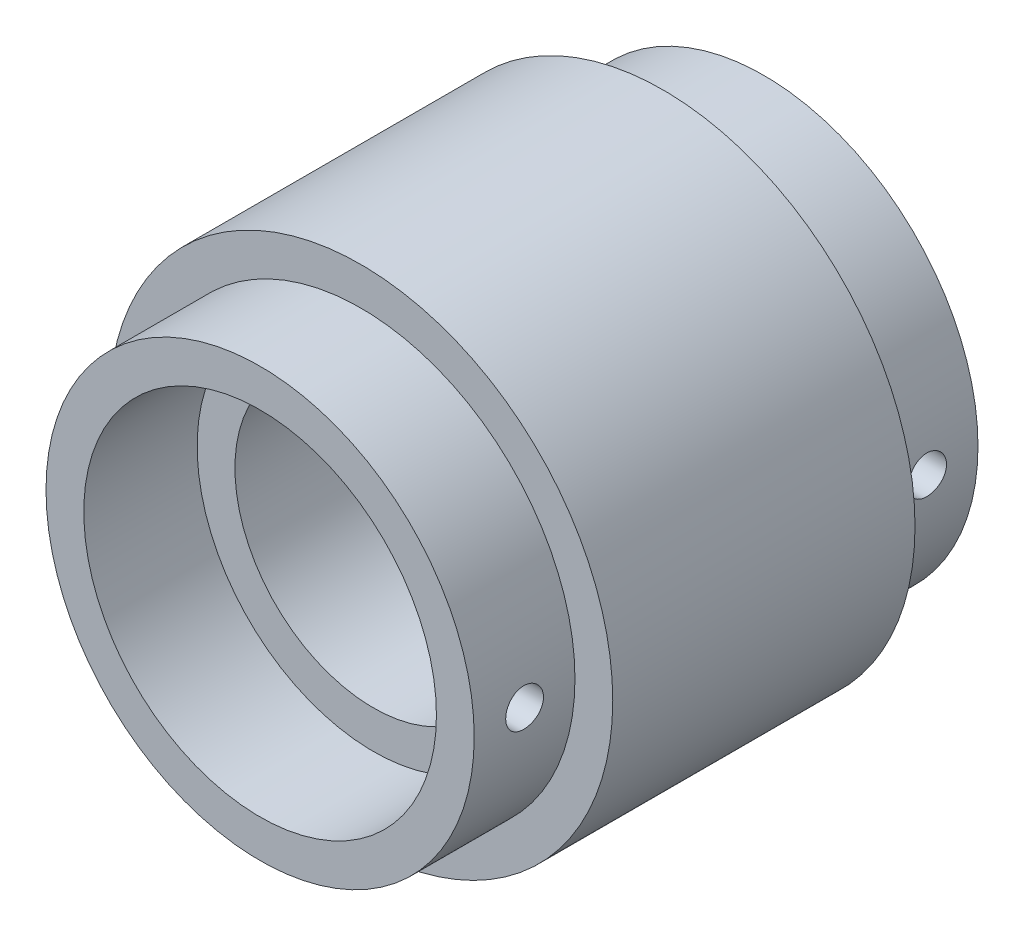
ISO-10303-21;
HEADER;
FILE_DESCRIPTION(('STEP AP214'),'2;1');
FILE_NAME('part.step','',(''),(''),'','','');
FILE_SCHEMA(('AUTOMOTIVE_DESIGN { 1 0 10303 214 1 1 1 1 }'));
ENDSEC;
DATA;
#1=APPLICATION_CONTEXT('core data for automotive mechanical design processes');
#2=APPLICATION_PROTOCOL_DEFINITION('international standard','automotive_design',2000,#1);
#3=PRODUCT_CONTEXT('',#1,'mechanical');
#4=PRODUCT('Part','Part','',(#3));
#5=PRODUCT_RELATED_PRODUCT_CATEGORY('part','',(#4));
#6=PRODUCT_DEFINITION_FORMATION('','',#4);
#7=PRODUCT_DEFINITION_CONTEXT('part definition',#1,'design');
#8=PRODUCT_DEFINITION('design','',#6,#7);
#9=PRODUCT_DEFINITION_SHAPE('','',#8);
#10=(LENGTH_UNIT() NAMED_UNIT(*) SI_UNIT(.MILLI.,.METRE.));
#11=(NAMED_UNIT(*) PLANE_ANGLE_UNIT() SI_UNIT($,.RADIAN.));
#12=(NAMED_UNIT(*) SI_UNIT($,.STERADIAN.) SOLID_ANGLE_UNIT());
#13=UNCERTAINTY_MEASURE_WITH_UNIT(LENGTH_MEASURE(1.E-05),#10,'distance_accuracy_value','');
#14=(GEOMETRIC_REPRESENTATION_CONTEXT(3) GLOBAL_UNCERTAINTY_ASSIGNED_CONTEXT((#13)) GLOBAL_UNIT_ASSIGNED_CONTEXT((#10,
#11,#12)) REPRESENTATION_CONTEXT('',''));
#15=CARTESIAN_POINT('',(0.,0.,0.));
#16=DIRECTION('',(0.,0.,1.));
#17=DIRECTION('',(1.,0.,0.));
#18=AXIS2_PLACEMENT_3D('',#15,#16,#17);
#19=CARTESIAN_POINT('',(0.,0.,20.));
#20=DIRECTION('',(0.,0.,1.));
#21=DIRECTION('',(1.,0.,0.));
#22=AXIS2_PLACEMENT_3D('',#19,#20,#21);
#23=CYLINDRICAL_SURFACE('',#22,14.);
#24=CARTESIAN_POINT('',(0.,0.,11.));
#25=DIRECTION('',(0.,0.,1.));
#26=DIRECTION('',(1.,0.,0.));
#27=AXIS2_PLACEMENT_3D('',#24,#25,#26);
#28=CIRCLE('',#27,14.);
#29=CARTESIAN_POINT('',(14.,0.,11.));
#30=VERTEX_POINT('',#29);
#31=EDGE_CURVE('E38',#30,#30,#28,.T.);
#32=ORIENTED_EDGE('',*,*,#31,.F.);
#33=EDGE_LOOP('',(#32));
#34=FACE_BOUND('',#33,.T.);
#35=CARTESIAN_POINT('',(0.,0.,20.));
#36=DIRECTION('',(0.,0.,1.));
#37=DIRECTION('',(1.,0.,0.));
#38=AXIS2_PLACEMENT_3D('',#35,#36,#37);
#39=CIRCLE('',#38,14.);
#40=CARTESIAN_POINT('',(14.,0.,20.));
#41=VERTEX_POINT('',#40);
#42=EDGE_CURVE('E42',#41,#41,#39,.T.);
#43=ORIENTED_EDGE('',*,*,#42,.T.);
#44=EDGE_LOOP('',(#43));
#45=FACE_BOUND('',#44,.T.);
#46=CARTESIAN_POINT('',(14.,0.,14.5));
#47=CARTESIAN_POINT('',(13.9999989720618,-0.0839973684623564,14.5000036207019));
#48=CARTESIAN_POINT('',(13.9992360275065,-0.168049471788861,14.5070793221215));
#49=CARTESIAN_POINT('',(13.9962658597227,-0.333821153364659,14.5351975840512));
#50=CARTESIAN_POINT('',(13.9940570672004,-0.415538096384694,14.5562553207345));
#51=CARTESIAN_POINT('',(13.9884444049242,-0.574215086679191,14.6117156111501));
#52=CARTESIAN_POINT('',(13.9850412789497,-0.651178059521745,14.6461098608724));
#53=CARTESIAN_POINT('',(13.9774199420794,-0.798222664781042,14.7272501675866));
#54=CARTESIAN_POINT('',(13.9732018874118,-0.868305612275356,14.7739938577237));
#55=CARTESIAN_POINT('',(13.964403436078,-0.999904467230662,14.8787117019334));
#56=CARTESIAN_POINT('',(13.959821772381,-1.06138815276102,14.9367262467107));
#57=CARTESIAN_POINT('',(13.9508228918212,-1.17376607832023,15.0622526231375));
#58=CARTESIAN_POINT('',(13.9464056827682,-1.22465981597738,15.1297649050912));
#59=CARTESIAN_POINT('',(13.9382230587834,-1.31452903007566,15.2725742909415));
#60=CARTESIAN_POINT('',(13.9344592647275,-1.35347504707262,15.3478900343593));
#61=CARTESIAN_POINT('',(13.9280256549691,-1.41815517868436,15.5040394574843));
#62=CARTESIAN_POINT('',(13.9253558084694,-1.44388966523887,15.5848729817787));
#63=CARTESIAN_POINT('',(13.9214240491911,-1.48131999143385,15.7494329661843));
#64=CARTESIAN_POINT('',(13.9201567479638,-1.49306957301225,15.8331470713884));
#65=CARTESIAN_POINT('',(13.919156916522,-1.50236273378441,16.0013678978012));
#66=CARTESIAN_POINT('',(13.9194243403621,-1.49990673825451,16.0858745952063));
#67=CARTESIAN_POINT('',(13.9214588185844,-1.48090270755366,16.2529102447853));
#68=CARTESIAN_POINT('',(13.9232196140191,-1.46441348676883,16.3354459753885));
#69=CARTESIAN_POINT('',(13.92803266796,-1.41790265413675,16.4965718512746));
#70=CARTESIAN_POINT('',(13.9310849462276,-1.38788083522162,16.575161936163));
#71=CARTESIAN_POINT('',(13.9381442300285,-1.31509254595635,16.7263506188431));
#72=CARTESIAN_POINT('',(13.9421531763498,-1.27230012313471,16.7989366277697));
#73=CARTESIAN_POINT('',(13.9506724910759,-1.17520397125327,16.9359189016586));
#74=CARTESIAN_POINT('',(13.9551828763347,-1.12089985521526,17.0003148911879));
#75=CARTESIAN_POINT('',(13.964224741634,-1.00199398737117,17.1194308272547));
#76=CARTESIAN_POINT('',(13.9687562128002,-0.937341467650281,17.1741001088758));
#77=CARTESIAN_POINT('',(13.9773081517919,-0.79974993270207,17.2718176057708));
#78=CARTESIAN_POINT('',(13.9813286189078,-0.726810905968591,17.3148658049081));
#79=CARTESIAN_POINT('',(13.9884071619177,-0.574680679930816,17.388117667482));
#80=CARTESIAN_POINT('',(13.9914650333095,-0.495488156543226,17.4183186020122));
#81=CARTESIAN_POINT('',(13.996271832416,-0.333116173755533,17.4649806998032));
#82=CARTESIAN_POINT('',(13.9980208050858,-0.249936851389131,17.4814423349517));
#83=CARTESIAN_POINT('',(14.0000069536861,-0.082391003259108,17.5000939080794));
#84=CARTESIAN_POINT('',(14.0002515320482,0.0019676589614681,17.5023537278468));
#85=CARTESIAN_POINT('',(13.999221220073,0.169862499172727,17.4927212957146));
#86=CARTESIAN_POINT('',(13.9979463533593,0.253398689930399,17.4808292638405));
#87=CARTESIAN_POINT('',(13.9940250997174,0.417074417596074,17.4432886972512));
#88=CARTESIAN_POINT('',(13.9913819912927,0.497221580734071,17.4176730412053));
#89=CARTESIAN_POINT('',(13.9850206034345,0.652081625351161,17.3534462526011));
#90=CARTESIAN_POINT('',(13.9813022965487,0.726794368015868,17.3148347882255));
#91=CARTESIAN_POINT('',(13.9731875979172,0.868979698172293,17.2255402299778));
#92=CARTESIAN_POINT('',(13.9687886603917,0.936423420726922,17.174811409086));
#93=CARTESIAN_POINT('',(13.9598140395794,1.0618636536134,17.062787475555));
#94=CARTESIAN_POINT('',(13.955238351189,1.11985989089444,17.001492057626));
#95=CARTESIAN_POINT('',(13.9464035114229,1.22500289525196,16.869769183513));
#96=CARTESIAN_POINT('',(13.9421457513136,1.27210367548466,16.799304913417));
#97=CARTESIAN_POINT('',(13.9344504956076,1.35380220515131,16.6514253530529));
#98=CARTESIAN_POINT('',(13.9310129873748,1.38840014719752,16.5740101698898));
#99=CARTESIAN_POINT('',(13.9253563662176,1.44403456823946,16.4145815618943));
#100=CARTESIAN_POINT('',(13.9231348303938,1.4650980301971,16.3325776426312));
#101=CARTESIAN_POINT('',(13.9201543262932,1.49315296500731,16.1661718429898));
#102=CARTESIAN_POINT('',(13.9193953092803,1.50014490677259,16.0817700426125));
#103=CARTESIAN_POINT('',(13.9194269169975,1.49985126967978,15.913421505837));
#104=CARTESIAN_POINT('',(13.9202097012228,1.49263792882135,15.8294746326706));
#105=CARTESIAN_POINT('',(13.9232199578512,1.46429034750351,15.6639928721513));
#106=CARTESIAN_POINT('',(13.9254474315429,1.44315609462868,15.5824579869496));
#107=CARTESIAN_POINT('',(13.9310938471125,1.38758726934598,15.4241176286987));
#108=CARTESIAN_POINT('',(13.9345125661186,1.35315518471866,15.3473112741424));
#109=CARTESIAN_POINT('',(13.9421567007954,1.27197540134453,15.2005560163175));
#110=CARTESIAN_POINT('',(13.9463821158424,1.22522771211909,15.1306071077473));
#111=CARTESIAN_POINT('',(13.9551893042071,1.12047309614238,14.9991822389677));
#112=CARTESIAN_POINT('',(13.9597727171597,1.06241229533165,14.9377493283454));
#113=CARTESIAN_POINT('',(13.9687645955809,0.936788436693425,14.8254680641987));
#114=CARTESIAN_POINT('',(13.9731730190714,0.869223116281761,14.7746222381358));
#115=CARTESIAN_POINT('',(13.9813315236118,0.726294289727543,14.6848415429898));
#116=CARTESIAN_POINT('',(13.985079694864,0.650909132345846,14.6459409923291));
#117=CARTESIAN_POINT('',(13.9914751074927,0.4946830501634,14.5814034976389));
#118=CARTESIAN_POINT('',(13.9941235777272,0.413848333053745,14.5557517409156));
#119=CARTESIAN_POINT('',(13.997362764335,0.277138279310809,14.5247693925093));
#120=CARTESIAN_POINT('',(13.9983470622526,0.222133982989378,14.5154937322981));
#121=CARTESIAN_POINT('',(13.9996660194708,0.111427819030549,14.5031078501412));
#122=CARTESIAN_POINT('',(14.0000006819599,0.0557259548181626,14.4999975979358));
#123=CARTESIAN_POINT('',(14.,0.,14.5));
#124=B_SPLINE_CURVE_WITH_KNOTS('',3,(#46,#47,#48,#49,#50,#51,#52,#53,#54,#55,#56,#57,#58,#59,
#60,#61,#62,#63,#64,#65,#66,#67,#68,#69,#70,#71,#72,#73,#74,#75,#76,#77,#78,#79,#80,#81,#82,#83,
#84,#85,#86,#87,#88,#89,#90,#91,#92,#93,#94,#95,#96,#97,#98,#99,#100,#101,#102,#103,#104,#105,
#106,#107,#108,#109,#110,#111,#112,#113,#114,#115,#116,#117,#118,#119,#120,#121,#122,#123),
.UNSPECIFIED.,.T.,.F.,(4,2,2,2,2,2,2,2,2,2,2,2,2,2,2,2,2,2,2,2,2,2,2,2,2,2,2,2,2,2,2,2,2,2,2,2,
2,2,4),(0.,0.251788599945356,0.503850940260849,0.755756584763052,1.00761398480183,
1.26039117907526,1.5131803619984,1.76658792718727,2.01998835788766,2.27241183115226,
2.52482774758373,2.77619094881418,3.02755799638761,3.27943939251041,3.531329257246,
3.78449503509989,4.03766116448934,4.29088104245252,4.54409222301009,4.79605646471764,
5.04801678907029,5.29937615584524,5.55074194097749,5.80307171791347,6.05540878638004,
6.30879222304767,6.5621717560548,6.81504455967778,7.067908936547,7.31949074464278,
7.57107277711321,7.82260776597885,8.07414256037933,8.32690582829999,8.57972936954861,
8.83327261241941,9.08653176657272,9.25357544028006,9.42061829413531),.UNSPECIFIED.);
#125=CARTESIAN_POINT('',(14.,0.,14.5));
#126=VERTEX_POINT('',#125);
#127=EDGE_CURVE('E73',#126,#126,#124,.T.);
#128=ORIENTED_EDGE('',*,*,#127,.F.);
#129=EDGE_LOOP('',(#128));
#130=FACE_BOUND('',#129,.T.);
#131=ADVANCED_FACE('F31',(#34,#45,#130),#23,.F.);
#132=CARTESIAN_POINT('',(0.,0.,12.));
#133=DIRECTION('',(0.,0.,1.));
#134=DIRECTION('',(1.,0.,0.));
#135=AXIS2_PLACEMENT_3D('',#132,#133,#134);
#136=CYLINDRICAL_SURFACE('',#135,17.);
#137=CARTESIAN_POINT('',(0.,0.,20.));
#138=DIRECTION('',(0.,0.,1.));
#139=DIRECTION('',(1.,0.,0.));
#140=AXIS2_PLACEMENT_3D('',#137,#138,#139);
#141=CIRCLE('',#140,17.);
#142=CARTESIAN_POINT('',(17.,0.,20.));
#143=VERTEX_POINT('',#142);
#144=EDGE_CURVE('E52',#143,#143,#141,.T.);
#145=ORIENTED_EDGE('',*,*,#144,.F.);
#146=EDGE_LOOP('',(#145));
#147=FACE_BOUND('',#146,.T.);
#148=CARTESIAN_POINT('',(0.,0.,12.));
#149=DIRECTION('',(0.,0.,1.));
#150=DIRECTION('',(1.,0.,0.));
#151=AXIS2_PLACEMENT_3D('',#148,#149,#150);
#152=CIRCLE('',#151,17.);
#153=CARTESIAN_POINT('',(17.,0.,12.));
#154=VERTEX_POINT('',#153);
#155=EDGE_CURVE('E51',#154,#154,#152,.T.);
#156=ORIENTED_EDGE('',*,*,#155,.T.);
#157=EDGE_LOOP('',(#156));
#158=FACE_BOUND('',#157,.T.);
#159=CARTESIAN_POINT('',(17.,0.,17.5));
#160=CARTESIAN_POINT('',(16.9999991366692,0.0840802358664998,17.4999963358136));
#161=CARTESIAN_POINT('',(16.9993695779826,0.168217256556168,17.4929067281508));
#162=CARTESIAN_POINT('',(16.9969186756702,0.334162101229269,17.4647299984391));
#163=CARTESIAN_POINT('',(16.9950959921048,0.41596719842642,17.4436271384143));
#164=CARTESIAN_POINT('',(16.9904647505681,0.574820875222161,17.3880400381334));
#165=CARTESIAN_POINT('',(16.987656760896,0.651872166635592,17.3535635102583));
#166=CARTESIAN_POINT('',(16.9813695548534,0.799076197986142,17.2722218661469));
#167=CARTESIAN_POINT('',(16.9778904793125,0.869230380650742,17.2253593483915));
#168=CARTESIAN_POINT('',(16.9706402702899,1.00086587600031,17.1204326359042));
#169=CARTESIAN_POINT('',(16.9668684232275,1.06232489780315,17.062340523003));
#170=CARTESIAN_POINT('',(16.9594637448475,1.17463411612825,16.9366628211714));
#171=CARTESIAN_POINT('',(16.9558309197295,1.22548383998342,16.8690768094917));
#172=CARTESIAN_POINT('',(16.9491080590586,1.31520757683625,16.726193431763));
#173=CARTESIAN_POINT('',(16.9460189232131,1.35406181812048,16.6508836040906));
#174=CARTESIAN_POINT('',(16.9407415951097,1.4185653804641,16.4947770863768));
#175=CARTESIAN_POINT('',(16.9385533852002,1.44421496024305,16.4139805038728));
#176=CARTESIAN_POINT('',(16.9353318119117,1.48151599727451,16.2494186319148));
#177=CARTESIAN_POINT('',(16.9342954355067,1.4932039820181,16.1656616820616));
#178=CARTESIAN_POINT('',(16.9334854039232,1.50236291350133,15.9973689116293));
#179=CARTESIAN_POINT('',(16.9337117224385,1.49983415642455,15.9128331073131));
#180=CARTESIAN_POINT('',(16.9353987670437,1.48066155151999,15.7456330149522));
#181=CARTESIAN_POINT('',(16.9368560169532,1.46405745233264,15.6629641290013));
#182=CARTESIAN_POINT('',(16.9408352833957,1.41726727227212,15.5015911801985));
#183=CARTESIAN_POINT('',(16.9433573114304,1.38708104468568,15.422887160185));
#184=CARTESIAN_POINT('',(16.949185966917,1.31393915314471,15.2715516941627));
#185=CARTESIAN_POINT('',(16.9524936854572,1.27096571042549,15.1989288845309));
#186=CARTESIAN_POINT('',(16.9595200433788,1.17348205158942,15.0619117959138));
#187=CARTESIAN_POINT('',(16.9632386921032,1.11897157314286,14.9975177040868));
#188=CARTESIAN_POINT('',(16.9706833852774,0.999738513125818,14.8785548838013));
#189=CARTESIAN_POINT('',(16.9744094114053,0.934981578037633,14.8240205798198));
#190=CARTESIAN_POINT('',(16.9814369213681,0.797213511535078,14.7265917065545));
#191=CARTESIAN_POINT('',(16.984738404872,0.72420237368621,14.6836971463444));
#192=CARTESIAN_POINT('',(16.9905455904275,0.571975637683148,14.6107673127884));
#193=CARTESIAN_POINT('',(16.9930511943361,0.492759275839951,14.5807336252059));
#194=CARTESIAN_POINT('',(16.996983221751,0.330381291940774,14.5344024948699));
#195=CARTESIAN_POINT('',(16.9984096703698,0.247219761738224,14.5181047324754));
#196=CARTESIAN_POINT('',(17.0000194423459,0.0796104030231009,14.499751387245));
#197=CARTESIAN_POINT('',(17.0002069148657,-0.00483218206200147,14.4976482679761));
#198=CARTESIAN_POINT('',(16.9993287054252,-0.172868703136017,14.5076192906525));
#199=CARTESIAN_POINT('',(16.9982630365922,-0.256462648005644,14.5196932840849));
#200=CARTESIAN_POINT('',(16.9950010291973,-0.420292963294032,14.5576363855799));
#201=CARTESIAN_POINT('',(16.9928065018153,-0.500534490142742,14.5834833981096));
#202=CARTESIAN_POINT('',(16.9875332102989,-0.655542086495677,14.6482162300089));
#203=CARTESIAN_POINT('',(16.9844544305543,-0.73030805930762,14.687102279566));
#204=CARTESIAN_POINT('',(16.9777472136144,-0.872458160373809,14.7769283803514));
#205=CARTESIAN_POINT('',(16.9741173526791,-0.939822365439241,14.827899852119));
#206=CARTESIAN_POINT('',(16.9667203650642,-1.06505544188414,14.940404609123));
#207=CARTESIAN_POINT('',(16.9629532357112,-1.12292412819998,15.0019381001608));
#208=CARTESIAN_POINT('',(16.9556939504594,-1.22768709603156,15.1340267804784));
#209=CARTESIAN_POINT('',(16.9522025910796,-1.27455030776123,15.2046066618826));
#210=CARTESIAN_POINT('',(16.9459016871797,-1.35575886575025,15.35266202157));
#211=CARTESIAN_POINT('',(16.9430921351492,-1.39010434989805,15.4301374238842));
#212=CARTESIAN_POINT('',(16.9384775839307,-1.44524983562932,15.5896755241072));
#213=CARTESIAN_POINT('',(16.9366711856513,-1.46606870960856,15.6717316565099));
#214=CARTESIAN_POINT('',(16.9342628924147,-1.49363139208435,15.8381915045614));
#215=CARTESIAN_POINT('',(16.9336609712026,-1.5003755073806,15.9225951689984));
#216=CARTESIAN_POINT('',(16.9337302183425,-1.49959349529965,16.0910453959998));
#217=CARTESIAN_POINT('',(16.934397031893,-1.49211618154857,16.1750921912636));
#218=CARTESIAN_POINT('',(16.936919354309,-1.46320550589638,16.340731154193));
#219=CARTESIAN_POINT('',(16.9387748648697,-1.44177212409336,16.4223233183579));
#220=CARTESIAN_POINT('',(16.9434643498395,-1.38557040876227,16.5807390934135));
#221=CARTESIAN_POINT('',(16.9462982480851,-1.35080311320261,16.6575630749392));
#222=CARTESIAN_POINT('',(16.9526253396978,-1.26892580427019,16.8042920474838));
#223=CARTESIAN_POINT('',(16.9561185245598,-1.22181595011684,16.8741971277408));
#224=CARTESIAN_POINT('',(16.9633848931066,-1.11640728077523,17.0053539357469));
#225=CARTESIAN_POINT('',(16.9671589585558,-1.05807223244496,17.0665764947836));
#226=CARTESIAN_POINT('',(16.9745537766173,-0.931936963261482,17.1783875140416));
#227=CARTESIAN_POINT('',(16.97817449202,-0.864134462128933,17.2289734049954));
#228=CARTESIAN_POINT('',(16.9848619761362,-0.72084309897252,17.3181516747292));
#229=CARTESIAN_POINT('',(16.9879276001517,-0.645338844429667,17.3567193852657));
#230=CARTESIAN_POINT('',(16.9931463894423,-0.488949731353307,17.4205795640191));
#231=CARTESIAN_POINT('',(16.9953005975204,-0.408071145215391,17.4458872117812));
#232=CARTESIAN_POINT('',(16.9979040364892,-0.272267186189504,17.4761005258256));
#233=CARTESIAN_POINT('',(16.9986864208092,-0.218213808395126,17.485050825264));
#234=CARTESIAN_POINT('',(16.9997346827935,-0.109448307539669,17.4970017459999));
#235=CARTESIAN_POINT('',(17.0000005620279,-0.0547361864815625,17.5000023853833));
#236=CARTESIAN_POINT('',(17.,0.,17.5));
#237=B_SPLINE_CURVE_WITH_KNOTS('',3,(#159,#160,#161,#162,#163,#164,#165,#166,#167,#168,#169,
#170,#171,#172,#173,#174,#175,#176,#177,#178,#179,#180,#181,#182,#183,#184,#185,#186,#187,#188,
#189,#190,#191,#192,#193,#194,#195,#196,#197,#198,#199,#200,#201,#202,#203,#204,#205,#206,#207,
#208,#209,#210,#211,#212,#213,#214,#215,#216,#217,#218,#219,#220,#221,#222,#223,#224,#225,#226,
#227,#228,#229,#230,#231,#232,#233,#234,#235,#236),.UNSPECIFIED.,.T.,.F.,(4,2,2,2,2,2,2,2,2,2,2,
2,2,2,2,2,2,2,2,2,2,2,2,2,2,2,2,2,2,2,2,2,2,2,2,2,2,2,4),(0.,0.252040852757286,
0.504365246877548,0.756544345352496,1.00867058061989,1.26143188749012,1.51420445301807,
1.76739145693377,2.02057349995601,2.27309168593404,2.52560461111023,2.77740680852379,
3.02921172595373,3.28136839051262,3.53353078923872,3.78655726723963,4.03958394248665,
4.2926418072939,4.54569378316716,4.79789789108671,5.05009935705509,5.30189743849976,
5.55369996535094,5.80616446692186,6.05863388833423,6.31180771599295,6.5649787547431,
6.81779580511232,7.07060734455154,7.32255269951578,7.57449841376498,7.8264245194705,
8.07834737548103,8.33109746875406,8.58390854338802,8.83723516529166,9.09027115274212,
9.25435010556812,9.4184285596224),.UNSPECIFIED.);
#238=CARTESIAN_POINT('',(17.,0.,17.5));
#239=VERTEX_POINT('',#238);
#240=EDGE_CURVE('E104',#239,#239,#237,.T.);
#241=ORIENTED_EDGE('',*,*,#240,.T.);
#242=EDGE_LOOP('',(#241));
#243=FACE_BOUND('',#242,.T.);
#244=ADVANCED_FACE('F128',(#147,#158,#243),#136,.T.);
#245=CARTESIAN_POINT('',(0.,0.,-20.));
#246=DIRECTION('',(0.,0.,-1.));
#247=DIRECTION('',(-1.,0.,0.));
#248=AXIS2_PLACEMENT_3D('',#245,#246,#247);
#249=CYLINDRICAL_SURFACE('',#248,14.);
#250=CARTESIAN_POINT('',(0.,0.,-11.));
#251=DIRECTION('',(0.,0.,-1.));
#252=DIRECTION('',(-1.,0.,0.));
#253=AXIS2_PLACEMENT_3D('',#250,#251,#252);
#254=CIRCLE('',#253,14.);
#255=CARTESIAN_POINT('',(-14.,0.,-11.));
#256=VERTEX_POINT('',#255);
#257=EDGE_CURVE('E60',#256,#256,#254,.T.);
#258=ORIENTED_EDGE('',*,*,#257,.F.);
#259=EDGE_LOOP('',(#258));
#260=FACE_BOUND('',#259,.T.);
#261=CARTESIAN_POINT('',(0.,0.,-20.));
#262=DIRECTION('',(0.,0.,-1.));
#263=DIRECTION('',(-1.,0.,0.));
#264=AXIS2_PLACEMENT_3D('',#261,#262,#263);
#265=CIRCLE('',#264,14.);
#266=CARTESIAN_POINT('',(-14.,0.,-20.));
#267=VERTEX_POINT('',#266);
#268=EDGE_CURVE('E63',#267,#267,#265,.T.);
#269=ORIENTED_EDGE('',*,*,#268,.T.);
#270=EDGE_LOOP('',(#269));
#271=FACE_BOUND('',#270,.T.);
#272=CARTESIAN_POINT('',(14.,0.,-14.5));
#273=CARTESIAN_POINT('',(13.9999989720618,0.0839973684623564,-14.5000036207019));
#274=CARTESIAN_POINT('',(13.9992360275065,0.168049471788861,-14.5070793221215));
#275=CARTESIAN_POINT('',(13.9962658597227,0.333821153364659,-14.5351975840512));
#276=CARTESIAN_POINT('',(13.9940570672004,0.415538096384694,-14.5562553207345));
#277=CARTESIAN_POINT('',(13.9884444049242,0.574215086679191,-14.6117156111501));
#278=CARTESIAN_POINT('',(13.9850412789497,0.651178059521745,-14.6461098608724));
#279=CARTESIAN_POINT('',(13.9774199420794,0.798222664781042,-14.7272501675866));
#280=CARTESIAN_POINT('',(13.9732018874118,0.868305612275356,-14.7739938577237));
#281=CARTESIAN_POINT('',(13.964403436078,0.999904467230662,-14.8787117019334));
#282=CARTESIAN_POINT('',(13.959821772381,1.06138815276102,-14.9367262467107));
#283=CARTESIAN_POINT('',(13.9508228918212,1.17376607832023,-15.0622526231375));
#284=CARTESIAN_POINT('',(13.9464056827682,1.22465981597738,-15.1297649050912));
#285=CARTESIAN_POINT('',(13.9382230587834,1.31452903007566,-15.2725742909415));
#286=CARTESIAN_POINT('',(13.9344592647275,1.35347504707262,-15.3478900343593));
#287=CARTESIAN_POINT('',(13.9280256549691,1.41815517868436,-15.5040394574843));
#288=CARTESIAN_POINT('',(13.9253558084694,1.44388966523887,-15.5848729817787));
#289=CARTESIAN_POINT('',(13.9214240491911,1.48131999143385,-15.7494329661843));
#290=CARTESIAN_POINT('',(13.9201567479638,1.49306957301225,-15.8331470713884));
#291=CARTESIAN_POINT('',(13.919156916522,1.50236273378441,-16.0013678978012));
#292=CARTESIAN_POINT('',(13.9194243403621,1.49990673825451,-16.0858745952063));
#293=CARTESIAN_POINT('',(13.9214588185844,1.48090270755366,-16.2529102447853));
#294=CARTESIAN_POINT('',(13.9232196140191,1.46441348676883,-16.3354459753885));
#295=CARTESIAN_POINT('',(13.92803266796,1.41790265413675,-16.4965718512746));
#296=CARTESIAN_POINT('',(13.9310849462276,1.38788083522162,-16.575161936163));
#297=CARTESIAN_POINT('',(13.9381442300285,1.31509254595635,-16.7263506188431));
#298=CARTESIAN_POINT('',(13.9421531763498,1.27230012313471,-16.7989366277697));
#299=CARTESIAN_POINT('',(13.9506724910759,1.17520397125327,-16.9359189016586));
#300=CARTESIAN_POINT('',(13.9551828763347,1.12089985521526,-17.0003148911879));
#301=CARTESIAN_POINT('',(13.964224741634,1.00199398737117,-17.1194308272547));
#302=CARTESIAN_POINT('',(13.9687562128002,0.937341467650281,-17.1741001088758));
#303=CARTESIAN_POINT('',(13.9773081517919,0.79974993270207,-17.2718176057708));
#304=CARTESIAN_POINT('',(13.9813286189078,0.726810905968591,-17.3148658049081));
#305=CARTESIAN_POINT('',(13.9884071619177,0.574680679930816,-17.388117667482));
#306=CARTESIAN_POINT('',(13.9914650333095,0.495488156543226,-17.4183186020122));
#307=CARTESIAN_POINT('',(13.996271832416,0.333116173755533,-17.4649806998032));
#308=CARTESIAN_POINT('',(13.9980208050858,0.249936851389131,-17.4814423349517));
#309=CARTESIAN_POINT('',(14.0000069536861,0.082391003259108,-17.5000939080794));
#310=CARTESIAN_POINT('',(14.0002515320482,-0.0019676589614681,-17.5023537278468));
#311=CARTESIAN_POINT('',(13.999221220073,-0.169862499172727,-17.4927212957146));
#312=CARTESIAN_POINT('',(13.9979463533593,-0.253398689930399,-17.4808292638405));
#313=CARTESIAN_POINT('',(13.9940250997174,-0.417074417596074,-17.4432886972512));
#314=CARTESIAN_POINT('',(13.9913819912927,-0.497221580734071,-17.4176730412053));
#315=CARTESIAN_POINT('',(13.9850206034345,-0.652081625351161,-17.3534462526011));
#316=CARTESIAN_POINT('',(13.9813022965487,-0.726794368015868,-17.3148347882255));
#317=CARTESIAN_POINT('',(13.9731875979172,-0.868979698172293,-17.2255402299778));
#318=CARTESIAN_POINT('',(13.9687886603917,-0.936423420726922,-17.174811409086));
#319=CARTESIAN_POINT('',(13.9598140395794,-1.0618636536134,-17.062787475555));
#320=CARTESIAN_POINT('',(13.955238351189,-1.11985989089444,-17.001492057626));
#321=CARTESIAN_POINT('',(13.9464035114229,-1.22500289525196,-16.869769183513));
#322=CARTESIAN_POINT('',(13.9421457513136,-1.27210367548466,-16.799304913417));
#323=CARTESIAN_POINT('',(13.9344504956076,-1.35380220515131,-16.6514253530529));
#324=CARTESIAN_POINT('',(13.9310129873748,-1.38840014719752,-16.5740101698898));
#325=CARTESIAN_POINT('',(13.9253563662176,-1.44403456823946,-16.4145815618943));
#326=CARTESIAN_POINT('',(13.9231348303938,-1.4650980301971,-16.3325776426312));
#327=CARTESIAN_POINT('',(13.9201543262932,-1.49315296500731,-16.1661718429898));
#328=CARTESIAN_POINT('',(13.9193953092803,-1.50014490677259,-16.0817700426125));
#329=CARTESIAN_POINT('',(13.9194269169975,-1.49985126967978,-15.913421505837));
#330=CARTESIAN_POINT('',(13.9202097012228,-1.49263792882135,-15.8294746326706));
#331=CARTESIAN_POINT('',(13.9232199578512,-1.46429034750351,-15.6639928721513));
#332=CARTESIAN_POINT('',(13.9254474315429,-1.44315609462868,-15.5824579869496));
#333=CARTESIAN_POINT('',(13.9310938471125,-1.38758726934598,-15.4241176286987));
#334=CARTESIAN_POINT('',(13.9345125661186,-1.35315518471866,-15.3473112741424));
#335=CARTESIAN_POINT('',(13.9421567007954,-1.27197540134453,-15.2005560163175));
#336=CARTESIAN_POINT('',(13.9463821158424,-1.22522771211909,-15.1306071077473));
#337=CARTESIAN_POINT('',(13.9551893042071,-1.12047309614238,-14.9991822389677));
#338=CARTESIAN_POINT('',(13.9597727171597,-1.06241229533165,-14.9377493283454));
#339=CARTESIAN_POINT('',(13.9687645955809,-0.936788436693425,-14.8254680641987));
#340=CARTESIAN_POINT('',(13.9731730190714,-0.869223116281761,-14.7746222381358));
#341=CARTESIAN_POINT('',(13.9813315236118,-0.726294289727543,-14.6848415429898));
#342=CARTESIAN_POINT('',(13.985079694864,-0.650909132345846,-14.6459409923291));
#343=CARTESIAN_POINT('',(13.9914751074927,-0.4946830501634,-14.5814034976389));
#344=CARTESIAN_POINT('',(13.9941235777272,-0.413848333053745,-14.5557517409156));
#345=CARTESIAN_POINT('',(13.997362764335,-0.277138279310809,-14.5247693925093));
#346=CARTESIAN_POINT('',(13.9983470622526,-0.222133982989378,-14.5154937322981));
#347=CARTESIAN_POINT('',(13.9996660194708,-0.111427819030549,-14.5031078501412));
#348=CARTESIAN_POINT('',(14.0000006819599,-0.0557259548181626,-14.4999975979358));
#349=CARTESIAN_POINT('',(14.,0.,-14.5));
#350=B_SPLINE_CURVE_WITH_KNOTS('',3,(#272,#273,#274,#275,#276,#277,#278,#279,#280,#281,#282,
#283,#284,#285,#286,#287,#288,#289,#290,#291,#292,#293,#294,#295,#296,#297,#298,#299,#300,#301,
#302,#303,#304,#305,#306,#307,#308,#309,#310,#311,#312,#313,#314,#315,#316,#317,#318,#319,#320,
#321,#322,#323,#324,#325,#326,#327,#328,#329,#330,#331,#332,#333,#334,#335,#336,#337,#338,#339,
#340,#341,#342,#343,#344,#345,#346,#347,#348,#349),.UNSPECIFIED.,.T.,.F.,(4,2,2,2,2,2,2,2,2,2,2,
2,2,2,2,2,2,2,2,2,2,2,2,2,2,2,2,2,2,2,2,2,2,2,2,2,2,2,4),(0.,0.251788599945356,
0.503850940260849,0.755756584763052,1.00761398480183,1.26039117907526,1.5131803619984,
1.76658792718727,2.01998835788766,2.27241183115226,2.52482774758373,2.77619094881418,
3.02755799638761,3.27943939251041,3.531329257246,3.78449503509989,4.03766116448934,
4.29088104245252,4.54409222301009,4.79605646471764,5.04801678907029,5.29937615584524,
5.55074194097749,5.80307171791347,6.05540878638004,6.30879222304767,6.5621717560548,
6.81504455967778,7.067908936547,7.31949074464278,7.57107277711321,7.82260776597885,
8.07414256037933,8.32690582829999,8.57972936954861,8.83327261241941,9.08653176657272,
9.25357544028006,9.42061829413531),.UNSPECIFIED.);
#351=CARTESIAN_POINT('',(14.,0.,-14.5));
#352=VERTEX_POINT('',#351);
#353=EDGE_CURVE('E83',#352,#352,#350,.T.);
#354=ORIENTED_EDGE('',*,*,#353,.F.);
#355=EDGE_LOOP('',(#354));
#356=FACE_BOUND('',#355,.T.);
#357=ADVANCED_FACE('F119',(#260,#271,#356),#249,.F.);
#358=CARTESIAN_POINT('',(0.,0.,-12.));
#359=DIRECTION('',(0.,0.,-1.));
#360=DIRECTION('',(-1.,0.,0.));
#361=AXIS2_PLACEMENT_3D('',#358,#359,#360);
#362=CYLINDRICAL_SURFACE('',#361,17.);
#363=CARTESIAN_POINT('',(0.,0.,-12.));
#364=DIRECTION('',(0.,0.,1.));
#365=DIRECTION('',(1.,0.,0.));
#366=AXIS2_PLACEMENT_3D('',#363,#364,#365);
#367=CIRCLE('',#366,17.);
#368=CARTESIAN_POINT('',(17.,0.,-12.));
#369=VERTEX_POINT('',#368);
#370=EDGE_CURVE('E69',#369,#369,#367,.T.);
#371=ORIENTED_EDGE('',*,*,#370,.F.);
#372=EDGE_LOOP('',(#371));
#373=FACE_BOUND('',#372,.T.);
#374=CARTESIAN_POINT('',(0.,0.,-20.));
#375=DIRECTION('',(0.,0.,1.));
#376=DIRECTION('',(1.,0.,0.));
#377=AXIS2_PLACEMENT_3D('',#374,#375,#376);
#378=CIRCLE('',#377,17.);
#379=CARTESIAN_POINT('',(17.,0.,-20.));
#380=VERTEX_POINT('',#379);
#381=EDGE_CURVE('E70',#380,#380,#378,.T.);
#382=ORIENTED_EDGE('',*,*,#381,.T.);
#383=EDGE_LOOP('',(#382));
#384=FACE_BOUND('',#383,.T.);
#385=CARTESIAN_POINT('',(17.,0.,-14.5));
#386=CARTESIAN_POINT('',(16.9999991366692,0.0840802358665,-14.5000036641864));
#387=CARTESIAN_POINT('',(16.9993695779826,0.168217256556168,-14.5070932718492));
#388=CARTESIAN_POINT('',(16.9969186756702,0.334162101229269,-14.5352700015609));
#389=CARTESIAN_POINT('',(16.9950959921048,0.41596719842642,-14.5563728615857));
#390=CARTESIAN_POINT('',(16.9904647505681,0.574820875222162,-14.6119599618666));
#391=CARTESIAN_POINT('',(16.987656760896,0.651872166635593,-14.6464364897417));
#392=CARTESIAN_POINT('',(16.9813695548534,0.799076197986143,-14.7277781338531));
#393=CARTESIAN_POINT('',(16.9778904793125,0.869230380650743,-14.7746406516085));
#394=CARTESIAN_POINT('',(16.9706402702899,1.00086587600031,-14.8795673640958));
#395=CARTESIAN_POINT('',(16.9668684232275,1.06232489780315,-14.937659476997));
#396=CARTESIAN_POINT('',(16.9594637448475,1.17463411612825,-15.0633371788286));
#397=CARTESIAN_POINT('',(16.9558309197295,1.22548383998342,-15.1309231905083));
#398=CARTESIAN_POINT('',(16.9491080590586,1.31520757683625,-15.273806568237));
#399=CARTESIAN_POINT('',(16.9460189232131,1.35406181812048,-15.3491163959094));
#400=CARTESIAN_POINT('',(16.9407415951097,1.41856538046411,-15.5052229136232));
#401=CARTESIAN_POINT('',(16.9385533852002,1.44421496024305,-15.5860194961272));
#402=CARTESIAN_POINT('',(16.9353318119117,1.48151599727451,-15.7505813680852));
#403=CARTESIAN_POINT('',(16.9342954355067,1.4932039820181,-15.8343383179384));
#404=CARTESIAN_POINT('',(16.9334854039232,1.50236291350133,-16.0026310883707));
#405=CARTESIAN_POINT('',(16.9337117224385,1.49983415642455,-16.087166892687));
#406=CARTESIAN_POINT('',(16.9353987670437,1.48066155151999,-16.2543669850478));
#407=CARTESIAN_POINT('',(16.9368560169532,1.46405745233264,-16.3370358709987));
#408=CARTESIAN_POINT('',(16.9408352833957,1.41726727227211,-16.4984088198015));
#409=CARTESIAN_POINT('',(16.9433573114304,1.38708104468568,-16.577112839815));
#410=CARTESIAN_POINT('',(16.949185966917,1.31393915314471,-16.7284483058373));
#411=CARTESIAN_POINT('',(16.9524936854572,1.27096571042549,-16.8010711154691));
#412=CARTESIAN_POINT('',(16.9595200433788,1.17348205158942,-16.9380882040862));
#413=CARTESIAN_POINT('',(16.9632386921032,1.11897157314286,-17.0024822959132));
#414=CARTESIAN_POINT('',(16.9706833852774,0.999738513125818,-17.1214451161987));
#415=CARTESIAN_POINT('',(16.9744094114053,0.934981578037633,-17.1759794201802));
#416=CARTESIAN_POINT('',(16.9814369213681,0.797213511535076,-17.2734082934455));
#417=CARTESIAN_POINT('',(16.984738404872,0.724202373686208,-17.3163028536556));
#418=CARTESIAN_POINT('',(16.9905455904275,0.571975637683145,-17.3892326872116));
#419=CARTESIAN_POINT('',(16.9930511943361,0.492759275839949,-17.4192663747941));
#420=CARTESIAN_POINT('',(16.996983221751,0.330381291940772,-17.4655975051301));
#421=CARTESIAN_POINT('',(16.9984096703698,0.247219761738222,-17.4818952675246));
#422=CARTESIAN_POINT('',(17.0000194423459,0.0796104030230991,-17.500248612755));
#423=CARTESIAN_POINT('',(17.0002069148657,-0.00483218206200329,-17.5023517320239));
#424=CARTESIAN_POINT('',(16.9993287054252,-0.172868703136019,-17.4923807093475));
#425=CARTESIAN_POINT('',(16.9982630365922,-0.256462648005646,-17.4803067159151));
#426=CARTESIAN_POINT('',(16.9950010291973,-0.420292963294034,-17.4423636144201));
#427=CARTESIAN_POINT('',(16.9928065018153,-0.500534490142743,-17.4165166018904));
#428=CARTESIAN_POINT('',(16.9875332102989,-0.655542086495678,-17.3517837699911));
#429=CARTESIAN_POINT('',(16.9844544305543,-0.730308059307621,-17.312897720434));
#430=CARTESIAN_POINT('',(16.9777472136144,-0.872458160373811,-17.2230716196486));
#431=CARTESIAN_POINT('',(16.9741173526791,-0.939822365439243,-17.172100147881));
#432=CARTESIAN_POINT('',(16.9667203650642,-1.06505544188414,-17.059595390877));
#433=CARTESIAN_POINT('',(16.9629532357112,-1.12292412819998,-16.9980618998392));
#434=CARTESIAN_POINT('',(16.9556939504594,-1.22768709603156,-16.8659732195216));
#435=CARTESIAN_POINT('',(16.9522025910796,-1.27455030776123,-16.7953933381174));
#436=CARTESIAN_POINT('',(16.9459016871797,-1.35575886575025,-16.64733797843));
#437=CARTESIAN_POINT('',(16.9430921351492,-1.39010434989805,-16.5698625761158));
#438=CARTESIAN_POINT('',(16.9384775839307,-1.44524983562932,-16.4103244758928));
#439=CARTESIAN_POINT('',(16.9366711856513,-1.46606870960856,-16.3282683434901));
#440=CARTESIAN_POINT('',(16.9342628924147,-1.49363139208435,-16.1618084954386));
#441=CARTESIAN_POINT('',(16.9336609712026,-1.5003755073806,-16.0774048310016));
#442=CARTESIAN_POINT('',(16.9337302183425,-1.49959349529965,-15.9089546040002));
#443=CARTESIAN_POINT('',(16.934397031893,-1.49211618154857,-15.8249078087364));
#444=CARTESIAN_POINT('',(16.936919354309,-1.46320550589638,-15.659268845807));
#445=CARTESIAN_POINT('',(16.9387748648697,-1.44177212409336,-15.5776766816421));
#446=CARTESIAN_POINT('',(16.9434643498395,-1.38557040876227,-15.4192609065865));
#447=CARTESIAN_POINT('',(16.9462982480851,-1.35080311320261,-15.3424369250608));
#448=CARTESIAN_POINT('',(16.9526253396978,-1.26892580427019,-15.1957079525162));
#449=CARTESIAN_POINT('',(16.9561185245598,-1.22181595011684,-15.1258028722592));
#450=CARTESIAN_POINT('',(16.9633848931066,-1.11640728077523,-14.9946460642531));
#451=CARTESIAN_POINT('',(16.9671589585558,-1.05807223244496,-14.9334235052164));
#452=CARTESIAN_POINT('',(16.9745537766173,-0.931936963261481,-14.8216124859584));
#453=CARTESIAN_POINT('',(16.97817449202,-0.864134462128932,-14.7710265950046));
#454=CARTESIAN_POINT('',(16.9848619761362,-0.72084309897252,-14.6818483252708));
#455=CARTESIAN_POINT('',(16.9879276001517,-0.645338844429666,-14.6432806147343));
#456=CARTESIAN_POINT('',(16.9931463894423,-0.488949731353306,-14.5794204359809));
#457=CARTESIAN_POINT('',(16.9953005975204,-0.408071145215389,-14.5541127882188));
#458=CARTESIAN_POINT('',(16.9979040364892,-0.272267186189502,-14.5238994741744));
#459=CARTESIAN_POINT('',(16.9986864208092,-0.218213808395125,-14.514949174736));
#460=CARTESIAN_POINT('',(16.9997346827935,-0.109448307539669,-14.5029982540001));
#461=CARTESIAN_POINT('',(17.0000005620279,-0.0547361864815624,-14.4999976146167));
#462=CARTESIAN_POINT('',(17.,0.,-14.5));
#463=B_SPLINE_CURVE_WITH_KNOTS('',3,(#385,#386,#387,#388,#389,#390,#391,#392,#393,#394,#395,
#396,#397,#398,#399,#400,#401,#402,#403,#404,#405,#406,#407,#408,#409,#410,#411,#412,#413,#414,
#415,#416,#417,#418,#419,#420,#421,#422,#423,#424,#425,#426,#427,#428,#429,#430,#431,#432,#433,
#434,#435,#436,#437,#438,#439,#440,#441,#442,#443,#444,#445,#446,#447,#448,#449,#450,#451,#452,
#453,#454,#455,#456,#457,#458,#459,#460,#461,#462),.UNSPECIFIED.,.T.,.F.,(4,2,2,2,2,2,2,2,2,2,2,
2,2,2,2,2,2,2,2,2,2,2,2,2,2,2,2,2,2,2,2,2,2,2,2,2,2,2,4),(0.,0.252040852757286,
0.504365246877549,0.756544345352496,1.00867058061989,1.26143188749013,1.51420445301807,
1.76739145693378,2.02057349995601,2.27309168593405,2.52560461111023,2.7774068085238,
3.02921172595374,3.28136839051263,3.53353078923872,3.78655726723963,4.03958394248665,
4.2926418072939,4.54569378316716,4.79789789108672,5.05009935705509,5.30189743849976,
5.55369996535094,5.80616446692186,6.05863388833424,6.31180771599295,6.5649787547431,
6.81779580511232,7.07060734455154,7.32255269951578,7.57449841376498,7.8264245194705,
8.07834737548103,8.33109746875406,8.58390854338803,8.83723516529167,9.09027115274212,
9.25435010556812,9.4184285596224),.UNSPECIFIED.);
#464=CARTESIAN_POINT('',(17.,0.,-14.5));
#465=VERTEX_POINT('',#464);
#466=EDGE_CURVE('E109',#465,#465,#463,.T.);
#467=ORIENTED_EDGE('',*,*,#466,.T.);
#468=EDGE_LOOP('',(#467));
#469=FACE_BOUND('',#468,.T.);
#470=ADVANCED_FACE('F116',(#373,#384,#469),#362,.T.);
#471=CARTESIAN_POINT('',(0.,0.,20.));
#472=DIRECTION('',(0.,0.,-1.));
#473=DIRECTION('',(-1.,0.,0.));
#474=AXIS2_PLACEMENT_3D('',#471,#472,#473);
#475=CYLINDRICAL_SURFACE('',#474,20.);
#476=CARTESIAN_POINT('',(0.,0.,12.));
#477=DIRECTION('',(0.,0.,1.));
#478=DIRECTION('',(1.,0.,0.));
#479=AXIS2_PLACEMENT_3D('',#476,#477,#478);
#480=CIRCLE('',#479,20.);
#481=CARTESIAN_POINT('',(20.,0.,12.));
#482=VERTEX_POINT('',#481);
#483=EDGE_CURVE('E46',#482,#482,#480,.T.);
#484=ORIENTED_EDGE('',*,*,#483,.F.);
#485=EDGE_LOOP('',(#484));
#486=FACE_BOUND('',#485,.T.);
#487=CARTESIAN_POINT('',(0.,0.,-12.));
#488=DIRECTION('',(0.,0.,1.));
#489=DIRECTION('',(1.,0.,0.));
#490=AXIS2_PLACEMENT_3D('',#487,#488,#489);
#491=CIRCLE('',#490,20.);
#492=CARTESIAN_POINT('',(20.,0.,-12.));
#493=VERTEX_POINT('',#492);
#494=EDGE_CURVE('E66',#493,#493,#491,.T.);
#495=ORIENTED_EDGE('',*,*,#494,.T.);
#496=EDGE_LOOP('',(#495));
#497=FACE_BOUND('',#496,.T.);
#498=ADVANCED_FACE('F33',(#486,#497),#475,.T.);
#499=CARTESIAN_POINT('',(0.,0.,-20.));
#500=DIRECTION('',(0.,0.,1.));
#501=DIRECTION('',(1.,0.,0.));
#502=AXIS2_PLACEMENT_3D('',#499,#500,#501);
#503=PLANE('',#502);
#504=ORIENTED_EDGE('',*,*,#268,.F.);
#505=EDGE_LOOP('',(#504));
#506=FACE_BOUND('',#505,.T.);
#507=ORIENTED_EDGE('',*,*,#381,.F.);
#508=EDGE_LOOP('',(#507));
#509=FACE_BOUND('',#508,.T.);
#510=ADVANCED_FACE('F159',(#506,#509),#503,.F.);
#511=CARTESIAN_POINT('',(0.,0.,20.));
#512=DIRECTION('',(0.,0.,1.));
#513=DIRECTION('',(1.,0.,0.));
#514=AXIS2_PLACEMENT_3D('',#511,#512,#513);
#515=PLANE('',#514);
#516=ORIENTED_EDGE('',*,*,#42,.F.);
#517=EDGE_LOOP('',(#516));
#518=FACE_BOUND('',#517,.T.);
#519=ORIENTED_EDGE('',*,*,#144,.T.);
#520=EDGE_LOOP('',(#519));
#521=FACE_BOUND('',#520,.T.);
#522=ADVANCED_FACE('F156',(#518,#521),#515,.T.);
#523=CARTESIAN_POINT('',(0.,0.,20.));
#524=DIRECTION('',(0.,0.,1.));
#525=DIRECTION('',(1.,0.,0.));
#526=AXIS2_PLACEMENT_3D('',#523,#524,#525);
#527=CYLINDRICAL_SURFACE('',#526,11.);
#528=CARTESIAN_POINT('',(0.,0.,-11.));
#529=DIRECTION('',(0.,0.,-1.));
#530=DIRECTION('',(-1.,0.,0.));
#531=AXIS2_PLACEMENT_3D('',#528,#529,#530);
#532=CIRCLE('',#531,11.);
#533=CARTESIAN_POINT('',(-11.,0.,-11.));
#534=VERTEX_POINT('',#533);
#535=EDGE_CURVE('E55',#534,#534,#532,.T.);
#536=ORIENTED_EDGE('',*,*,#535,.T.);
#537=EDGE_LOOP('',(#536));
#538=FACE_BOUND('',#537,.T.);
#539=CARTESIAN_POINT('',(0.,0.,11.));
#540=DIRECTION('',(0.,0.,1.));
#541=DIRECTION('',(1.,0.,0.));
#542=AXIS2_PLACEMENT_3D('',#539,#540,#541);
#543=CIRCLE('',#542,11.);
#544=CARTESIAN_POINT('',(11.,0.,11.));
#545=VERTEX_POINT('',#544);
#546=EDGE_CURVE('E10',#545,#545,#543,.T.);
#547=ORIENTED_EDGE('',*,*,#546,.T.);
#548=EDGE_LOOP('',(#547));
#549=FACE_BOUND('',#548,.T.);
#550=ADVANCED_FACE('F142',(#538,#549),#527,.F.);
#551=CARTESIAN_POINT('',(11.,0.,11.));
#552=DIRECTION('',(0.,0.,-1.));
#553=DIRECTION('',(-1.,0.,0.));
#554=AXIS2_PLACEMENT_3D('',#551,#552,#553);
#555=PLANE('',#554);
#556=ORIENTED_EDGE('',*,*,#546,.F.);
#557=EDGE_LOOP('',(#556));
#558=FACE_BOUND('',#557,.T.);
#559=ORIENTED_EDGE('',*,*,#31,.T.);
#560=EDGE_LOOP('',(#559));
#561=FACE_BOUND('',#560,.T.);
#562=ADVANCED_FACE('F137',(#558,#561),#555,.F.);
#563=CARTESIAN_POINT('',(0.,0.,12.));
#564=DIRECTION('',(0.,0.,1.));
#565=DIRECTION('',(1.,0.,0.));
#566=AXIS2_PLACEMENT_3D('',#563,#564,#565);
#567=PLANE('',#566);
#568=ORIENTED_EDGE('',*,*,#155,.F.);
#569=EDGE_LOOP('',(#568));
#570=FACE_BOUND('',#569,.T.);
#571=ORIENTED_EDGE('',*,*,#483,.T.);
#572=EDGE_LOOP('',(#571));
#573=FACE_BOUND('',#572,.T.);
#574=ADVANCED_FACE('F132',(#570,#573),#567,.T.);
#575=CARTESIAN_POINT('',(11.,0.,-11.));
#576=DIRECTION('',(0.,0.,1.));
#577=DIRECTION('',(1.,0.,0.));
#578=AXIS2_PLACEMENT_3D('',#575,#576,#577);
#579=PLANE('',#578);
#580=ORIENTED_EDGE('',*,*,#535,.F.);
#581=EDGE_LOOP('',(#580));
#582=FACE_BOUND('',#581,.T.);
#583=ORIENTED_EDGE('',*,*,#257,.T.);
#584=EDGE_LOOP('',(#583));
#585=FACE_BOUND('',#584,.T.);
#586=ADVANCED_FACE('F123',(#582,#585),#579,.F.);
#587=CARTESIAN_POINT('',(0.,0.,-12.));
#588=DIRECTION('',(0.,0.,-1.));
#589=DIRECTION('',(1.,0.,0.));
#590=AXIS2_PLACEMENT_3D('',#587,#588,#589);
#591=PLANE('',#590);
#592=ORIENTED_EDGE('',*,*,#494,.F.);
#593=EDGE_LOOP('',(#592));
#594=FACE_BOUND('',#593,.T.);
#595=ORIENTED_EDGE('',*,*,#370,.T.);
#596=EDGE_LOOP('',(#595));
#597=FACE_BOUND('',#596,.T.);
#598=ADVANCED_FACE('F121',(#594,#597),#591,.T.);
#599=CARTESIAN_POINT('',(20.001,0.,-16.));
#600=DIRECTION('',(-1.,0.,0.));
#601=DIRECTION('',(0.,0.,1.));
#602=AXIS2_PLACEMENT_3D('',#599,#600,#601);
#603=CYLINDRICAL_SURFACE('',#602,1.5);
#604=ORIENTED_EDGE('',*,*,#466,.F.);
#605=EDGE_LOOP('',(#604));
#606=FACE_BOUND('',#605,.T.);
#607=ORIENTED_EDGE('',*,*,#353,.T.);
#608=EDGE_LOOP('',(#607));
#609=FACE_BOUND('',#608,.T.);
#610=ADVANCED_FACE('F97',(#606,#609),#603,.F.);
#611=CARTESIAN_POINT('',(20.001,0.,16.));
#612=DIRECTION('',(-1.,0.,0.));
#613=DIRECTION('',(0.,0.,1.));
#614=AXIS2_PLACEMENT_3D('',#611,#612,#613);
#615=CYLINDRICAL_SURFACE('',#614,1.5);
#616=ORIENTED_EDGE('',*,*,#240,.F.);
#617=EDGE_LOOP('',(#616));
#618=FACE_BOUND('',#617,.T.);
#619=ORIENTED_EDGE('',*,*,#127,.T.);
#620=EDGE_LOOP('',(#619));
#621=FACE_BOUND('',#620,.T.);
#622=ADVANCED_FACE('F93',(#618,#621),#615,.F.);
#623=CLOSED_SHELL('',(#131,#244,#357,#470,#498,#510,#522,#550,#562,#574,#586,#598,#610,#622));
#624=MANIFOLD_SOLID_BREP('B2',#623);
#625=ADVANCED_BREP_SHAPE_REPRESENTATION('',(#18,#624),#14);
#626=SHAPE_DEFINITION_REPRESENTATION(#9,#625);
ENDSEC;
END-ISO-10303-21;
